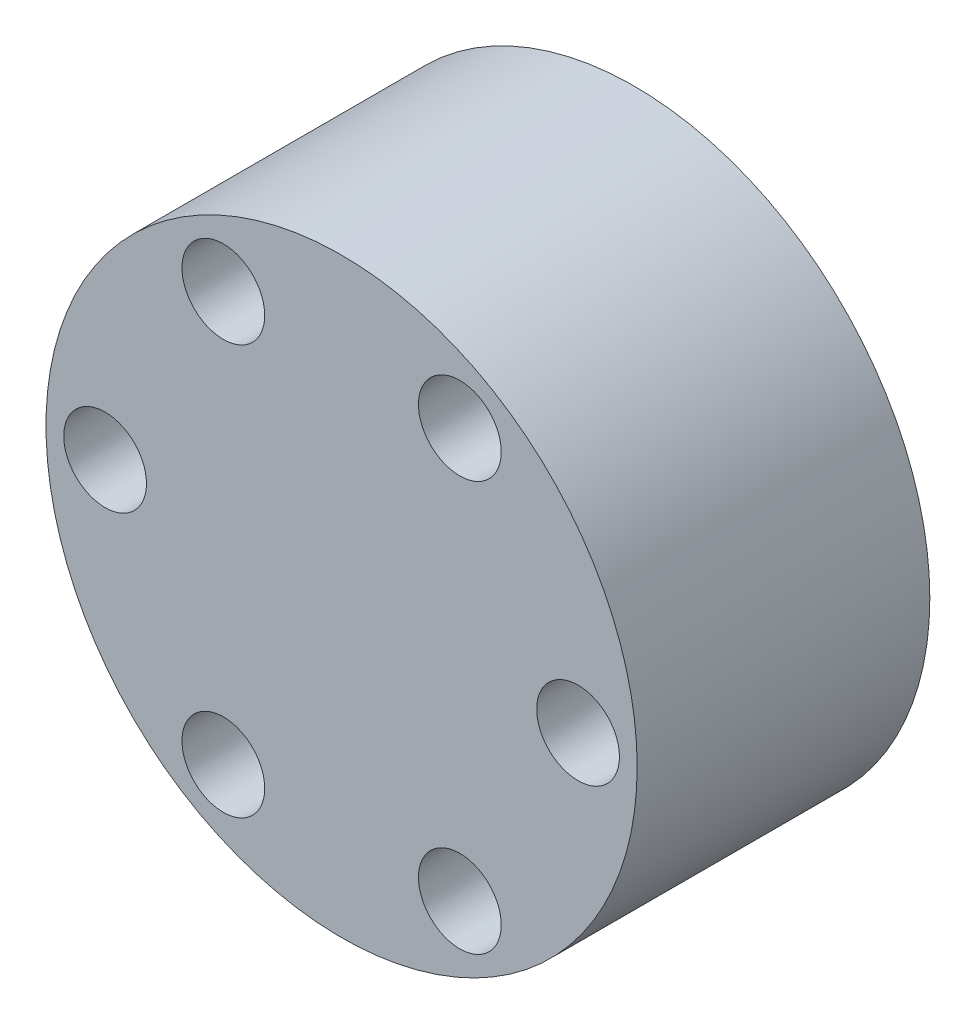
ISO-10303-21;
HEADER;
FILE_DESCRIPTION(('STEP AP214'),'2;1');
FILE_NAME('part.step','',(''),(''),'','','');
FILE_SCHEMA(('AUTOMOTIVE_DESIGN { 1 0 10303 214 1 1 1 1 }'));
ENDSEC;
DATA;
#1=APPLICATION_CONTEXT('core data for automotive mechanical design processes');
#2=APPLICATION_PROTOCOL_DEFINITION('international standard','automotive_design',2000,#1);
#3=PRODUCT_CONTEXT('',#1,'mechanical');
#4=PRODUCT('Part','Part','',(#3));
#5=PRODUCT_RELATED_PRODUCT_CATEGORY('part','',(#4));
#6=PRODUCT_DEFINITION_FORMATION('','',#4);
#7=PRODUCT_DEFINITION_CONTEXT('part definition',#1,'design');
#8=PRODUCT_DEFINITION('design','',#6,#7);
#9=PRODUCT_DEFINITION_SHAPE('','',#8);
#10=(LENGTH_UNIT() NAMED_UNIT(*) SI_UNIT(.MILLI.,.METRE.));
#11=(NAMED_UNIT(*) PLANE_ANGLE_UNIT() SI_UNIT($,.RADIAN.));
#12=(NAMED_UNIT(*) SI_UNIT($,.STERADIAN.) SOLID_ANGLE_UNIT());
#13=UNCERTAINTY_MEASURE_WITH_UNIT(LENGTH_MEASURE(1.E-05),#10,'distance_accuracy_value','');
#14=(GEOMETRIC_REPRESENTATION_CONTEXT(3) GLOBAL_UNCERTAINTY_ASSIGNED_CONTEXT((#13)) GLOBAL_UNIT_ASSIGNED_CONTEXT((#10,
#11,#12)) REPRESENTATION_CONTEXT('',''));
#15=CARTESIAN_POINT('',(0.,0.,0.));
#16=DIRECTION('',(0.,0.,1.));
#17=DIRECTION('',(1.,0.,0.));
#18=AXIS2_PLACEMENT_3D('',#15,#16,#17);
#19=CARTESIAN_POINT('',(0.,0.,7.425));
#20=DIRECTION('',(0.,0.,-1.));
#21=DIRECTION('',(-1.,0.,0.));
#22=AXIS2_PLACEMENT_3D('',#19,#20,#21);
#23=CYLINDRICAL_SURFACE('',#22,15.);
#24=CARTESIAN_POINT('',(0.,0.,7.425));
#25=DIRECTION('',(0.,0.,1.));
#26=DIRECTION('',(1.,0.,0.));
#27=AXIS2_PLACEMENT_3D('',#24,#25,#26);
#28=CIRCLE('',#27,15.);
#29=CARTESIAN_POINT('',(15.,0.,7.425));
#30=VERTEX_POINT('',#29);
#31=EDGE_CURVE('E10',#30,#30,#28,.T.);
#32=ORIENTED_EDGE('',*,*,#31,.F.);
#33=EDGE_LOOP('',(#32));
#34=FACE_BOUND('',#33,.T.);
#35=CARTESIAN_POINT('',(0.,0.,-7.425));
#36=DIRECTION('',(0.,0.,1.));
#37=DIRECTION('',(1.,0.,0.));
#38=AXIS2_PLACEMENT_3D('',#35,#36,#37);
#39=CIRCLE('',#38,15.);
#40=CARTESIAN_POINT('',(15.,0.,-7.425));
#41=VERTEX_POINT('',#40);
#42=EDGE_CURVE('E37',#41,#41,#39,.T.);
#43=ORIENTED_EDGE('',*,*,#42,.T.);
#44=EDGE_LOOP('',(#43));
#45=FACE_BOUND('',#44,.T.);
#46=ADVANCED_FACE('F40',(#34,#45),#23,.T.);
#47=CARTESIAN_POINT('',(0.,0.,7.425));
#48=DIRECTION('',(0.,0.,1.));
#49=DIRECTION('',(1.,0.,0.));
#50=AXIS2_PLACEMENT_3D('',#47,#48,#49);
#51=PLANE('',#50);
#52=CARTESIAN_POINT('',(-12.,0.,7.425));
#53=DIRECTION('',(0.,0.,1.));
#54=DIRECTION('',(1.,0.,0.));
#55=AXIS2_PLACEMENT_3D('',#52,#53,#54);
#56=CIRCLE('',#55,2.1);
#57=CARTESIAN_POINT('',(-9.9,0.,7.425));
#58=VERTEX_POINT('',#57);
#59=EDGE_CURVE('E59',#58,#58,#56,.T.);
#60=ORIENTED_EDGE('',*,*,#59,.F.);
#61=EDGE_LOOP('',(#60));
#62=FACE_BOUND('',#61,.T.);
#63=CARTESIAN_POINT('',(-6.,-10.3923048454133,7.425));
#64=DIRECTION('',(0.,0.,1.));
#65=DIRECTION('',(1.,0.,0.));
#66=AXIS2_PLACEMENT_3D('',#63,#64,#65);
#67=CIRCLE('',#66,2.1);
#68=CARTESIAN_POINT('',(-3.9,-10.3923048454133,7.425));
#69=VERTEX_POINT('',#68);
#70=EDGE_CURVE('E64',#69,#69,#67,.T.);
#71=ORIENTED_EDGE('',*,*,#70,.F.);
#72=EDGE_LOOP('',(#71));
#73=FACE_BOUND('',#72,.T.);
#74=CARTESIAN_POINT('',(6.00000000000001,-10.3923048454133,7.425));
#75=DIRECTION('',(0.,0.,1.));
#76=DIRECTION('',(1.,0.,0.));
#77=AXIS2_PLACEMENT_3D('',#74,#75,#76);
#78=CIRCLE('',#77,2.1);
#79=CARTESIAN_POINT('',(8.10000000000001,-10.3923048454133,7.425));
#80=VERTEX_POINT('',#79);
#81=EDGE_CURVE('E68',#80,#80,#78,.T.);
#82=ORIENTED_EDGE('',*,*,#81,.F.);
#83=EDGE_LOOP('',(#82));
#84=FACE_BOUND('',#83,.T.);
#85=CARTESIAN_POINT('',(12.,0.,7.425));
#86=DIRECTION('',(0.,0.,1.));
#87=DIRECTION('',(1.,0.,0.));
#88=AXIS2_PLACEMENT_3D('',#85,#86,#87);
#89=CIRCLE('',#88,2.1);
#90=CARTESIAN_POINT('',(14.1,0.,7.425));
#91=VERTEX_POINT('',#90);
#92=EDGE_CURVE('E78',#91,#91,#89,.T.);
#93=ORIENTED_EDGE('',*,*,#92,.F.);
#94=EDGE_LOOP('',(#93));
#95=FACE_BOUND('',#94,.T.);
#96=CARTESIAN_POINT('',(6.,10.3923048454133,7.425));
#97=DIRECTION('',(0.,0.,1.));
#98=DIRECTION('',(1.,0.,0.));
#99=AXIS2_PLACEMENT_3D('',#96,#97,#98);
#100=CIRCLE('',#99,2.1);
#101=CARTESIAN_POINT('',(8.1,10.3923048454133,7.425));
#102=VERTEX_POINT('',#101);
#103=EDGE_CURVE('E55',#102,#102,#100,.T.);
#104=ORIENTED_EDGE('',*,*,#103,.F.);
#105=EDGE_LOOP('',(#104));
#106=FACE_BOUND('',#105,.T.);
#107=CARTESIAN_POINT('',(-6.,10.3923048454133,7.425));
#108=DIRECTION('',(0.,0.,1.));
#109=DIRECTION('',(1.,0.,0.));
#110=AXIS2_PLACEMENT_3D('',#107,#108,#109);
#111=CIRCLE('',#110,2.1);
#112=CARTESIAN_POINT('',(-3.9,10.3923048454133,7.425));
#113=VERTEX_POINT('',#112);
#114=EDGE_CURVE('E47',#113,#113,#111,.T.);
#115=ORIENTED_EDGE('',*,*,#114,.F.);
#116=EDGE_LOOP('',(#115));
#117=FACE_BOUND('',#116,.T.);
#118=ORIENTED_EDGE('',*,*,#31,.T.);
#119=EDGE_LOOP('',(#118));
#120=FACE_BOUND('',#119,.T.);
#121=ADVANCED_FACE('F90',(#62,#73,#84,#95,#106,#117,#120),#51,.T.);
#122=CARTESIAN_POINT('',(0.,0.,-7.425));
#123=DIRECTION('',(0.,0.,1.));
#124=DIRECTION('',(1.,0.,0.));
#125=AXIS2_PLACEMENT_3D('',#122,#123,#124);
#126=PLANE('',#125);
#127=CARTESIAN_POINT('',(-12.,0.,-7.425));
#128=DIRECTION('',(0.,0.,1.));
#129=DIRECTION('',(1.,0.,0.));
#130=AXIS2_PLACEMENT_3D('',#127,#128,#129);
#131=CIRCLE('',#130,2.1);
#132=CARTESIAN_POINT('',(-9.9,0.,-7.425));
#133=VERTEX_POINT('',#132);
#134=EDGE_CURVE('E54',#133,#133,#131,.T.);
#135=ORIENTED_EDGE('',*,*,#134,.T.);
#136=EDGE_LOOP('',(#135));
#137=FACE_BOUND('',#136,.T.);
#138=CARTESIAN_POINT('',(-6.,-10.3923048454133,-7.425));
#139=DIRECTION('',(0.,0.,1.));
#140=DIRECTION('',(1.,0.,0.));
#141=AXIS2_PLACEMENT_3D('',#138,#139,#140);
#142=CIRCLE('',#141,2.1);
#143=CARTESIAN_POINT('',(-3.9,-10.3923048454133,-7.425));
#144=VERTEX_POINT('',#143);
#145=EDGE_CURVE('E62',#144,#144,#142,.T.);
#146=ORIENTED_EDGE('',*,*,#145,.T.);
#147=EDGE_LOOP('',(#146));
#148=FACE_BOUND('',#147,.T.);
#149=CARTESIAN_POINT('',(6.00000000000001,-10.3923048454133,-7.425));
#150=DIRECTION('',(0.,0.,1.));
#151=DIRECTION('',(1.,0.,0.));
#152=AXIS2_PLACEMENT_3D('',#149,#150,#151);
#153=CIRCLE('',#152,2.1);
#154=CARTESIAN_POINT('',(8.10000000000001,-10.3923048454133,-7.425));
#155=VERTEX_POINT('',#154);
#156=EDGE_CURVE('E70',#155,#155,#153,.T.);
#157=ORIENTED_EDGE('',*,*,#156,.T.);
#158=EDGE_LOOP('',(#157));
#159=FACE_BOUND('',#158,.T.);
#160=CARTESIAN_POINT('',(12.,0.,-7.425));
#161=DIRECTION('',(0.,0.,1.));
#162=DIRECTION('',(1.,0.,0.));
#163=AXIS2_PLACEMENT_3D('',#160,#161,#162);
#164=CIRCLE('',#163,2.1);
#165=CARTESIAN_POINT('',(14.1,0.,-7.425));
#166=VERTEX_POINT('',#165);
#167=EDGE_CURVE('E73',#166,#166,#164,.T.);
#168=ORIENTED_EDGE('',*,*,#167,.T.);
#169=EDGE_LOOP('',(#168));
#170=FACE_BOUND('',#169,.T.);
#171=CARTESIAN_POINT('',(6.,10.3923048454133,-7.425));
#172=DIRECTION('',(0.,0.,1.));
#173=DIRECTION('',(1.,0.,0.));
#174=AXIS2_PLACEMENT_3D('',#171,#172,#173);
#175=CIRCLE('',#174,2.1);
#176=CARTESIAN_POINT('',(8.1,10.3923048454133,-7.425));
#177=VERTEX_POINT('',#176);
#178=EDGE_CURVE('E80',#177,#177,#175,.T.);
#179=ORIENTED_EDGE('',*,*,#178,.T.);
#180=EDGE_LOOP('',(#179));
#181=FACE_BOUND('',#180,.T.);
#182=CARTESIAN_POINT('',(-6.,10.3923048454133,-7.425));
#183=DIRECTION('',(0.,0.,1.));
#184=DIRECTION('',(1.,0.,0.));
#185=AXIS2_PLACEMENT_3D('',#182,#183,#184);
#186=CIRCLE('',#185,2.1);
#187=CARTESIAN_POINT('',(-3.9,10.3923048454133,-7.425));
#188=VERTEX_POINT('',#187);
#189=EDGE_CURVE('E50',#188,#188,#186,.T.);
#190=ORIENTED_EDGE('',*,*,#189,.T.);
#191=EDGE_LOOP('',(#190));
#192=FACE_BOUND('',#191,.T.);
#193=ORIENTED_EDGE('',*,*,#42,.F.);
#194=EDGE_LOOP('',(#193));
#195=FACE_BOUND('',#194,.T.);
#196=ADVANCED_FACE('F89',(#137,#148,#159,#170,#181,#192,#195),#126,.F.);
#197=CARTESIAN_POINT('',(-6.,10.3923048454133,-7.425));
#198=DIRECTION('',(0.,0.,1.));
#199=DIRECTION('',(1.,0.,0.));
#200=AXIS2_PLACEMENT_3D('',#197,#198,#199);
#201=CYLINDRICAL_SURFACE('',#200,2.1);
#202=ORIENTED_EDGE('',*,*,#189,.F.);
#203=EDGE_LOOP('',(#202));
#204=FACE_BOUND('',#203,.T.);
#205=ORIENTED_EDGE('',*,*,#114,.T.);
#206=EDGE_LOOP('',(#205));
#207=FACE_BOUND('',#206,.T.);
#208=ADVANCED_FACE('F94',(#204,#207),#201,.F.);
#209=CARTESIAN_POINT('',(6.,10.3923048454133,-7.425));
#210=DIRECTION('',(0.,0.,1.));
#211=DIRECTION('',(1.,0.,0.));
#212=AXIS2_PLACEMENT_3D('',#209,#210,#211);
#213=CYLINDRICAL_SURFACE('',#212,2.1);
#214=ORIENTED_EDGE('',*,*,#178,.F.);
#215=EDGE_LOOP('',(#214));
#216=FACE_BOUND('',#215,.T.);
#217=ORIENTED_EDGE('',*,*,#103,.T.);
#218=EDGE_LOOP('',(#217));
#219=FACE_BOUND('',#218,.T.);
#220=ADVANCED_FACE('F82',(#216,#219),#213,.F.);
#221=CARTESIAN_POINT('',(12.,0.,-7.425));
#222=DIRECTION('',(0.,0.,1.));
#223=DIRECTION('',(1.,0.,0.));
#224=AXIS2_PLACEMENT_3D('',#221,#222,#223);
#225=CYLINDRICAL_SURFACE('',#224,2.1);
#226=ORIENTED_EDGE('',*,*,#167,.F.);
#227=EDGE_LOOP('',(#226));
#228=FACE_BOUND('',#227,.T.);
#229=ORIENTED_EDGE('',*,*,#92,.T.);
#230=EDGE_LOOP('',(#229));
#231=FACE_BOUND('',#230,.T.);
#232=ADVANCED_FACE('F104',(#228,#231),#225,.F.);
#233=CARTESIAN_POINT('',(6.00000000000001,-10.3923048454133,-7.425));
#234=DIRECTION('',(0.,0.,1.));
#235=DIRECTION('',(1.,0.,0.));
#236=AXIS2_PLACEMENT_3D('',#233,#234,#235);
#237=CYLINDRICAL_SURFACE('',#236,2.1);
#238=ORIENTED_EDGE('',*,*,#156,.F.);
#239=EDGE_LOOP('',(#238));
#240=FACE_BOUND('',#239,.T.);
#241=ORIENTED_EDGE('',*,*,#81,.T.);
#242=EDGE_LOOP('',(#241));
#243=FACE_BOUND('',#242,.T.);
#244=ADVANCED_FACE('F147',(#240,#243),#237,.F.);
#245=CARTESIAN_POINT('',(-6.,-10.3923048454133,-7.425));
#246=DIRECTION('',(0.,0.,1.));
#247=DIRECTION('',(1.,0.,0.));
#248=AXIS2_PLACEMENT_3D('',#245,#246,#247);
#249=CYLINDRICAL_SURFACE('',#248,2.1);
#250=ORIENTED_EDGE('',*,*,#145,.F.);
#251=EDGE_LOOP('',(#250));
#252=FACE_BOUND('',#251,.T.);
#253=ORIENTED_EDGE('',*,*,#70,.T.);
#254=EDGE_LOOP('',(#253));
#255=FACE_BOUND('',#254,.T.);
#256=ADVANCED_FACE('F157',(#252,#255),#249,.F.);
#257=CARTESIAN_POINT('',(-12.,0.,-7.425));
#258=DIRECTION('',(0.,0.,1.));
#259=DIRECTION('',(1.,0.,0.));
#260=AXIS2_PLACEMENT_3D('',#257,#258,#259);
#261=CYLINDRICAL_SURFACE('',#260,2.1);
#262=ORIENTED_EDGE('',*,*,#134,.F.);
#263=EDGE_LOOP('',(#262));
#264=FACE_BOUND('',#263,.T.);
#265=ORIENTED_EDGE('',*,*,#59,.T.);
#266=EDGE_LOOP('',(#265));
#267=FACE_BOUND('',#266,.T.);
#268=ADVANCED_FACE('F168',(#264,#267),#261,.F.);
#269=CLOSED_SHELL('',(#46,#121,#196,#208,#220,#232,#244,#256,#268));
#270=MANIFOLD_SOLID_BREP('B2',#269);
#271=ADVANCED_BREP_SHAPE_REPRESENTATION('',(#18,#270),#14);
#272=SHAPE_DEFINITION_REPRESENTATION(#9,#271);
ENDSEC;
END-ISO-10303-21;
